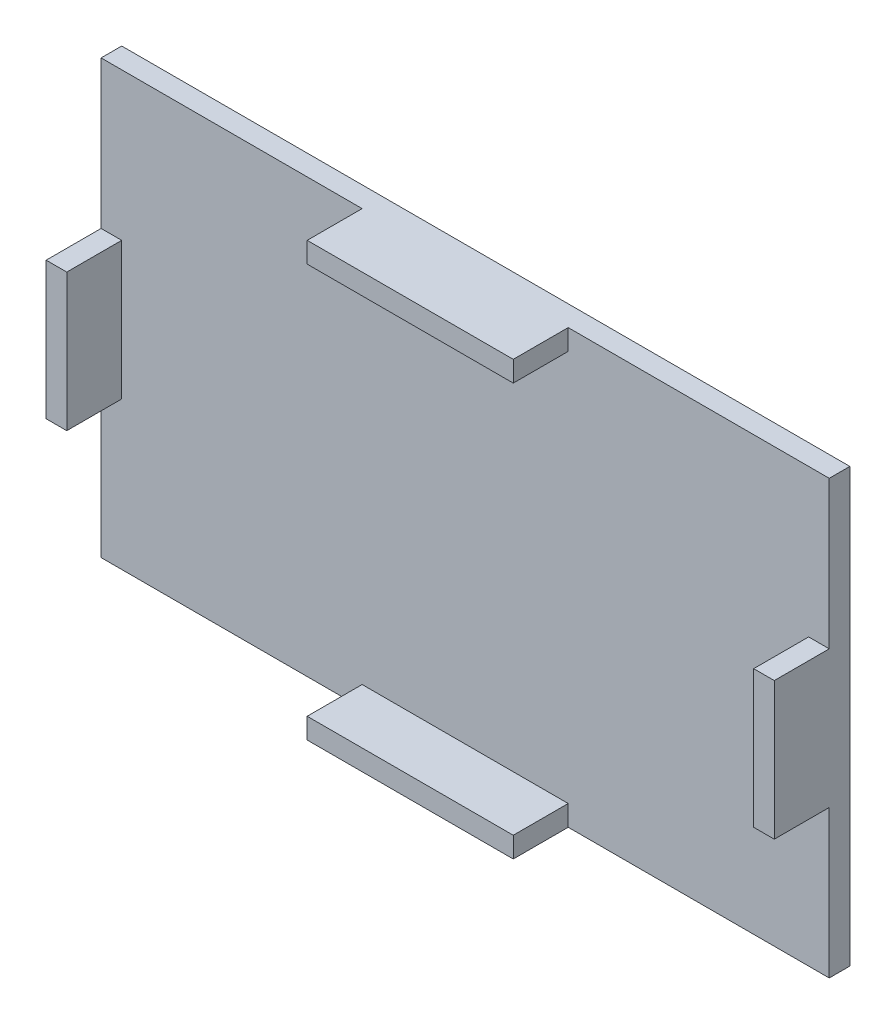
ISO-10303-21;
HEADER;
FILE_DESCRIPTION(('STEP AP214'),'2;1');
FILE_NAME('part.step','',(''),(''),'','','');
FILE_SCHEMA(('AUTOMOTIVE_DESIGN { 1 0 10303 214 1 1 1 1 }'));
ENDSEC;
DATA;
#1=APPLICATION_CONTEXT('core data for automotive mechanical design processes');
#2=APPLICATION_PROTOCOL_DEFINITION('international standard','automotive_design',2000,#1);
#3=PRODUCT_CONTEXT('',#1,'mechanical');
#4=PRODUCT('Part','Part','',(#3));
#5=PRODUCT_RELATED_PRODUCT_CATEGORY('part','',(#4));
#6=PRODUCT_DEFINITION_FORMATION('','',#4);
#7=PRODUCT_DEFINITION_CONTEXT('part definition',#1,'design');
#8=PRODUCT_DEFINITION('design','',#6,#7);
#9=PRODUCT_DEFINITION_SHAPE('','',#8);
#10=(LENGTH_UNIT() NAMED_UNIT(*) SI_UNIT(.MILLI.,.METRE.));
#11=(NAMED_UNIT(*) PLANE_ANGLE_UNIT() SI_UNIT($,.RADIAN.));
#12=(NAMED_UNIT(*) SI_UNIT($,.STERADIAN.) SOLID_ANGLE_UNIT());
#13=UNCERTAINTY_MEASURE_WITH_UNIT(LENGTH_MEASURE(1.E-05),#10,'distance_accuracy_value','');
#14=(GEOMETRIC_REPRESENTATION_CONTEXT(3) GLOBAL_UNCERTAINTY_ASSIGNED_CONTEXT((#13)) GLOBAL_UNIT_ASSIGNED_CONTEXT((#10,
#11,#12)) REPRESENTATION_CONTEXT('',''));
#15=CARTESIAN_POINT('',(0.,0.,0.));
#16=DIRECTION('',(0.,0.,1.));
#17=DIRECTION('',(1.,0.,0.));
#18=AXIS2_PLACEMENT_3D('',#15,#16,#17);
#19=CARTESIAN_POINT('',(0.,0.,1.5));
#20=DIRECTION('',(0.,0.,-1.));
#21=DIRECTION('',(-1.,0.,0.));
#22=AXIS2_PLACEMENT_3D('',#19,#20,#21);
#23=PLANE('',#22);
#24=DIRECTION('',(0.,1.,0.));
#25=VECTOR('',#24,1.);
#26=CARTESIAN_POINT('',(34.,0.,1.5));
#27=LINE('',#26,#25);
#28=CARTESIAN_POINT('',(34.,0.,1.5));
#29=VERTEX_POINT('',#28);
#30=CARTESIAN_POINT('',(34.,1.5,1.5));
#31=VERTEX_POINT('',#30);
#32=EDGE_CURVE('E335',#29,#31,#27,.T.);
#33=ORIENTED_EDGE('',*,*,#32,.F.);
#34=DIRECTION('',(1.,0.,0.));
#35=VECTOR('',#34,1.);
#36=CARTESIAN_POINT('',(53.,0.,1.5));
#37=LINE('',#36,#35);
#38=CARTESIAN_POINT('',(53.,0.,1.5));
#39=VERTEX_POINT('',#38);
#40=EDGE_CURVE('E191',#29,#39,#37,.T.);
#41=ORIENTED_EDGE('',*,*,#40,.T.);
#42=DIRECTION('',(0.,1.,0.));
#43=VECTOR('',#42,1.);
#44=CARTESIAN_POINT('',(53.,31.5,1.5));
#45=LINE('',#44,#43);
#46=CARTESIAN_POINT('',(53.,10.75,1.5));
#47=VERTEX_POINT('',#46);
#48=EDGE_CURVE('E291',#39,#47,#45,.T.);
#49=ORIENTED_EDGE('',*,*,#48,.T.);
#50=DIRECTION('',(1.,0.,0.));
#51=VECTOR('',#50,1.);
#52=CARTESIAN_POINT('',(51.5,10.75,1.5));
#53=LINE('',#52,#51);
#54=CARTESIAN_POINT('',(51.5,10.75,1.5));
#55=VERTEX_POINT('',#54);
#56=EDGE_CURVE('E205',#55,#47,#53,.T.);
#57=ORIENTED_EDGE('',*,*,#56,.F.);
#58=DIRECTION('',(0.,-1.,0.));
#59=VECTOR('',#58,1.);
#60=CARTESIAN_POINT('',(51.5,20.75,1.5));
#61=LINE('',#60,#59);
#62=CARTESIAN_POINT('',(51.5,20.75,1.5));
#63=VERTEX_POINT('',#62);
#64=EDGE_CURVE('E195',#63,#55,#61,.T.);
#65=ORIENTED_EDGE('',*,*,#64,.F.);
#66=DIRECTION('',(-1.,0.,0.));
#67=VECTOR('',#66,1.);
#68=CARTESIAN_POINT('',(53.,20.75,1.5));
#69=LINE('',#68,#67);
#70=CARTESIAN_POINT('',(53.,20.75,1.5));
#71=VERTEX_POINT('',#70);
#72=EDGE_CURVE('E192',#71,#63,#69,.T.);
#73=ORIENTED_EDGE('',*,*,#72,.F.);
#74=CARTESIAN_POINT('',(53.,31.5,1.5));
#75=VERTEX_POINT('',#74);
#76=EDGE_CURVE('E290',#71,#75,#45,.T.);
#77=ORIENTED_EDGE('',*,*,#76,.T.);
#78=DIRECTION('',(-1.,0.,0.));
#79=VECTOR('',#78,1.);
#80=CARTESIAN_POINT('',(0.,31.5,1.5));
#81=LINE('',#80,#79);
#82=CARTESIAN_POINT('',(34.,31.5,1.5));
#83=VERTEX_POINT('',#82);
#84=EDGE_CURVE('E294',#75,#83,#81,.T.);
#85=ORIENTED_EDGE('',*,*,#84,.T.);
#86=DIRECTION('',(0.,1.,0.));
#87=VECTOR('',#86,1.);
#88=CARTESIAN_POINT('',(34.,30.,1.5));
#89=LINE('',#88,#87);
#90=CARTESIAN_POINT('',(34.,30.,1.5));
#91=VERTEX_POINT('',#90);
#92=EDGE_CURVE('E232',#91,#83,#89,.T.);
#93=ORIENTED_EDGE('',*,*,#92,.F.);
#94=DIRECTION('',(1.,0.,0.));
#95=VECTOR('',#94,1.);
#96=CARTESIAN_POINT('',(19.,30.,1.5));
#97=LINE('',#96,#95);
#98=CARTESIAN_POINT('',(19.,30.,1.5));
#99=VERTEX_POINT('',#98);
#100=EDGE_CURVE('E241',#99,#91,#97,.T.);
#101=ORIENTED_EDGE('',*,*,#100,.F.);
#102=DIRECTION('',(0.,-1.,0.));
#103=VECTOR('',#102,1.);
#104=CARTESIAN_POINT('',(19.,31.5,1.5));
#105=LINE('',#104,#103);
#106=CARTESIAN_POINT('',(19.,31.5,1.5));
#107=VERTEX_POINT('',#106);
#108=EDGE_CURVE('E227',#107,#99,#105,.T.);
#109=ORIENTED_EDGE('',*,*,#108,.F.);
#110=CARTESIAN_POINT('',(0.,31.5,1.5));
#111=VERTEX_POINT('',#110);
#112=EDGE_CURVE('E293',#107,#111,#81,.T.);
#113=ORIENTED_EDGE('',*,*,#112,.T.);
#114=DIRECTION('',(0.,-1.,0.));
#115=VECTOR('',#114,1.);
#116=CARTESIAN_POINT('',(0.,0.,1.5));
#117=LINE('',#116,#115);
#118=CARTESIAN_POINT('',(0.,20.75,1.5));
#119=VERTEX_POINT('',#118);
#120=EDGE_CURVE('E297',#111,#119,#117,.T.);
#121=ORIENTED_EDGE('',*,*,#120,.T.);
#122=DIRECTION('',(-1.,0.,0.));
#123=VECTOR('',#122,1.);
#124=CARTESIAN_POINT('',(0.,20.75,1.5));
#125=LINE('',#124,#123);
#126=CARTESIAN_POINT('',(1.5,20.75,1.5));
#127=VERTEX_POINT('',#126);
#128=EDGE_CURVE('E262',#127,#119,#125,.T.);
#129=ORIENTED_EDGE('',*,*,#128,.F.);
#130=DIRECTION('',(0.,1.,0.));
#131=VECTOR('',#130,1.);
#132=CARTESIAN_POINT('',(1.5,20.75,1.5));
#133=LINE('',#132,#131);
#134=CARTESIAN_POINT('',(1.5,10.75,1.5));
#135=VERTEX_POINT('',#134);
#136=EDGE_CURVE('E271',#135,#127,#133,.T.);
#137=ORIENTED_EDGE('',*,*,#136,.F.);
#138=DIRECTION('',(1.,0.,0.));
#139=VECTOR('',#138,1.);
#140=CARTESIAN_POINT('',(1.5,10.75,1.5));
#141=LINE('',#140,#139);
#142=CARTESIAN_POINT('',(0.,10.75,1.5));
#143=VERTEX_POINT('',#142);
#144=EDGE_CURVE('E257',#143,#135,#141,.T.);
#145=ORIENTED_EDGE('',*,*,#144,.F.);
#146=CARTESIAN_POINT('',(0.,0.,1.5));
#147=VERTEX_POINT('',#146);
#148=EDGE_CURVE('E296',#143,#147,#117,.T.);
#149=ORIENTED_EDGE('',*,*,#148,.T.);
#150=CARTESIAN_POINT('',(19.,0.,1.5));
#151=VERTEX_POINT('',#150);
#152=EDGE_CURVE('E288',#147,#151,#37,.T.);
#153=ORIENTED_EDGE('',*,*,#152,.T.);
#154=DIRECTION('',(0.,-1.,0.));
#155=VECTOR('',#154,1.);
#156=CARTESIAN_POINT('',(19.,1.5,1.5));
#157=LINE('',#156,#155);
#158=CARTESIAN_POINT('',(19.,1.5,1.5));
#159=VERTEX_POINT('',#158);
#160=EDGE_CURVE('E53',#159,#151,#157,.T.);
#161=ORIENTED_EDGE('',*,*,#160,.F.);
#162=DIRECTION('',(-1.,0.,0.));
#163=VECTOR('',#162,1.);
#164=CARTESIAN_POINT('',(34.,1.5,1.5));
#165=LINE('',#164,#163);
#166=EDGE_CURVE('E48',#31,#159,#165,.T.);
#167=ORIENTED_EDGE('',*,*,#166,.F.);
#168=EDGE_LOOP('',(#33,#41,#49,#57,#65,#73,#77,#85,#93,#101,#109,#113,#121,#129,#137,#145,#149,
#153,#161,#167));
#169=FACE_BOUND('',#168,.T.);
#170=ADVANCED_FACE('F33',(#169),#23,.F.);
#171=CARTESIAN_POINT('',(53.,0.,1.5));
#172=DIRECTION('',(0.,1.,0.));
#173=DIRECTION('',(-1.,0.,0.));
#174=AXIS2_PLACEMENT_3D('',#171,#172,#173);
#175=PLANE('',#174);
#176=DIRECTION('',(1.,0.,0.));
#177=VECTOR('',#176,1.);
#178=CARTESIAN_POINT('',(53.,0.,0.));
#179=LINE('',#178,#177);
#180=CARTESIAN_POINT('',(0.,0.,0.));
#181=VERTEX_POINT('',#180);
#182=CARTESIAN_POINT('',(53.,0.,0.));
#183=VERTEX_POINT('',#182);
#184=EDGE_CURVE('E287',#181,#183,#179,.T.);
#185=ORIENTED_EDGE('',*,*,#184,.T.);
#186=DIRECTION('',(0.,0.,-1.));
#187=VECTOR('',#186,1.);
#188=CARTESIAN_POINT('',(53.,0.,1.5));
#189=LINE('',#188,#187);
#190=EDGE_CURVE('E11',#39,#183,#189,.T.);
#191=ORIENTED_EDGE('',*,*,#190,.F.);
#192=ORIENTED_EDGE('',*,*,#40,.F.);
#193=DIRECTION('',(0.,0.,-1.));
#194=VECTOR('',#193,1.);
#195=CARTESIAN_POINT('',(34.,0.,5.5));
#196=LINE('',#195,#194);
#197=CARTESIAN_POINT('',(34.,0.,5.5));
#198=VERTEX_POINT('',#197);
#199=EDGE_CURVE('E173',#198,#29,#196,.T.);
#200=ORIENTED_EDGE('',*,*,#199,.F.);
#201=DIRECTION('',(1.,0.,0.));
#202=VECTOR('',#201,1.);
#203=CARTESIAN_POINT('',(19.,0.,5.5));
#204=LINE('',#203,#202);
#205=CARTESIAN_POINT('',(19.,0.,5.5));
#206=VERTEX_POINT('',#205);
#207=EDGE_CURVE('E179',#206,#198,#204,.T.);
#208=ORIENTED_EDGE('',*,*,#207,.F.);
#209=DIRECTION('',(0.,0.,-1.));
#210=VECTOR('',#209,1.);
#211=CARTESIAN_POINT('',(19.,0.,5.5));
#212=LINE('',#211,#210);
#213=EDGE_CURVE('E329',#206,#151,#212,.T.);
#214=ORIENTED_EDGE('',*,*,#213,.T.);
#215=ORIENTED_EDGE('',*,*,#152,.F.);
#216=DIRECTION('',(0.,0.,-1.));
#217=VECTOR('',#216,1.);
#218=CARTESIAN_POINT('',(0.,0.,1.5));
#219=LINE('',#218,#217);
#220=EDGE_CURVE('E299',#147,#181,#219,.T.);
#221=ORIENTED_EDGE('',*,*,#220,.T.);
#222=EDGE_LOOP('',(#185,#191,#192,#200,#208,#214,#215,#221));
#223=FACE_BOUND('',#222,.T.);
#224=ADVANCED_FACE('F35',(#223),#175,.F.);
#225=CARTESIAN_POINT('',(53.,31.5,1.5));
#226=DIRECTION('',(-1.,0.,0.));
#227=DIRECTION('',(0.,-1.,0.));
#228=AXIS2_PLACEMENT_3D('',#225,#226,#227);
#229=PLANE('',#228);
#230=DIRECTION('',(0.,1.,0.));
#231=VECTOR('',#230,1.);
#232=CARTESIAN_POINT('',(53.,31.5,0.));
#233=LINE('',#232,#231);
#234=CARTESIAN_POINT('',(53.,31.5,0.));
#235=VERTEX_POINT('',#234);
#236=EDGE_CURVE('E301',#183,#235,#233,.T.);
#237=ORIENTED_EDGE('',*,*,#236,.T.);
#238=DIRECTION('',(0.,0.,-1.));
#239=VECTOR('',#238,1.);
#240=CARTESIAN_POINT('',(53.,31.5,1.5));
#241=LINE('',#240,#239);
#242=EDGE_CURVE('E41',#75,#235,#241,.T.);
#243=ORIENTED_EDGE('',*,*,#242,.F.);
#244=ORIENTED_EDGE('',*,*,#76,.F.);
#245=DIRECTION('',(0.,0.,-1.));
#246=VECTOR('',#245,1.);
#247=CARTESIAN_POINT('',(53.,20.75,5.5));
#248=LINE('',#247,#246);
#249=CARTESIAN_POINT('',(53.,20.75,5.5));
#250=VERTEX_POINT('',#249);
#251=EDGE_CURVE('E224',#250,#71,#248,.T.);
#252=ORIENTED_EDGE('',*,*,#251,.F.);
#253=DIRECTION('',(0.,1.,0.));
#254=VECTOR('',#253,1.);
#255=CARTESIAN_POINT('',(53.,20.75,5.5));
#256=LINE('',#255,#254);
#257=CARTESIAN_POINT('',(53.,10.75,5.5));
#258=VERTEX_POINT('',#257);
#259=EDGE_CURVE('E201',#258,#250,#256,.T.);
#260=ORIENTED_EDGE('',*,*,#259,.F.);
#261=DIRECTION('',(0.,0.,-1.));
#262=VECTOR('',#261,1.);
#263=CARTESIAN_POINT('',(53.,10.75,5.5));
#264=LINE('',#263,#262);
#265=EDGE_CURVE('E210',#258,#47,#264,.T.);
#266=ORIENTED_EDGE('',*,*,#265,.T.);
#267=ORIENTED_EDGE('',*,*,#48,.F.);
#268=ORIENTED_EDGE('',*,*,#190,.T.);
#269=EDGE_LOOP('',(#237,#243,#244,#252,#260,#266,#267,#268));
#270=FACE_BOUND('',#269,.T.);
#271=ADVANCED_FACE('F357',(#270),#229,.F.);
#272=CARTESIAN_POINT('',(0.,31.5,1.5));
#273=DIRECTION('',(0.,-1.,0.));
#274=DIRECTION('',(0.,0.,-1.));
#275=AXIS2_PLACEMENT_3D('',#272,#273,#274);
#276=PLANE('',#275);
#277=DIRECTION('',(-1.,0.,0.));
#278=VECTOR('',#277,1.);
#279=CARTESIAN_POINT('',(0.,31.5,0.));
#280=LINE('',#279,#278);
#281=CARTESIAN_POINT('',(0.,31.5,0.));
#282=VERTEX_POINT('',#281);
#283=EDGE_CURVE('E303',#235,#282,#280,.T.);
#284=ORIENTED_EDGE('',*,*,#283,.T.);
#285=DIRECTION('',(0.,0.,-1.));
#286=VECTOR('',#285,1.);
#287=CARTESIAN_POINT('',(0.,31.5,1.5));
#288=LINE('',#287,#286);
#289=EDGE_CURVE('E309',#111,#282,#288,.T.);
#290=ORIENTED_EDGE('',*,*,#289,.F.);
#291=ORIENTED_EDGE('',*,*,#112,.F.);
#292=DIRECTION('',(0.,0.,-1.));
#293=VECTOR('',#292,1.);
#294=CARTESIAN_POINT('',(19.,31.5,5.5));
#295=LINE('',#294,#293);
#296=CARTESIAN_POINT('',(19.,31.5,5.5));
#297=VERTEX_POINT('',#296);
#298=EDGE_CURVE('E254',#297,#107,#295,.T.);
#299=ORIENTED_EDGE('',*,*,#298,.F.);
#300=DIRECTION('',(-1.,0.,0.));
#301=VECTOR('',#300,1.);
#302=CARTESIAN_POINT('',(34.,31.5,5.5));
#303=LINE('',#302,#301);
#304=CARTESIAN_POINT('',(34.,31.5,5.5));
#305=VERTEX_POINT('',#304);
#306=EDGE_CURVE('E228',#305,#297,#303,.T.);
#307=ORIENTED_EDGE('',*,*,#306,.F.);
#308=DIRECTION('',(0.,0.,-1.));
#309=VECTOR('',#308,1.);
#310=CARTESIAN_POINT('',(34.,31.5,5.5));
#311=LINE('',#310,#309);
#312=EDGE_CURVE('E238',#305,#83,#311,.T.);
#313=ORIENTED_EDGE('',*,*,#312,.T.);
#314=ORIENTED_EDGE('',*,*,#84,.F.);
#315=ORIENTED_EDGE('',*,*,#242,.T.);
#316=EDGE_LOOP('',(#284,#290,#291,#299,#307,#313,#314,#315));
#317=FACE_BOUND('',#316,.T.);
#318=ADVANCED_FACE('F316',(#317),#276,.F.);
#319=CARTESIAN_POINT('',(0.,0.,1.5));
#320=DIRECTION('',(1.,0.,0.));
#321=DIRECTION('',(0.,0.,-1.));
#322=AXIS2_PLACEMENT_3D('',#319,#320,#321);
#323=PLANE('',#322);
#324=DIRECTION('',(0.,-1.,0.));
#325=VECTOR('',#324,1.);
#326=CARTESIAN_POINT('',(0.,0.,0.));
#327=LINE('',#326,#325);
#328=EDGE_CURVE('E305',#282,#181,#327,.T.);
#329=ORIENTED_EDGE('',*,*,#328,.T.);
#330=ORIENTED_EDGE('',*,*,#220,.F.);
#331=ORIENTED_EDGE('',*,*,#148,.F.);
#332=DIRECTION('',(0.,0.,-1.));
#333=VECTOR('',#332,1.);
#334=CARTESIAN_POINT('',(0.,10.75,5.5));
#335=LINE('',#334,#333);
#336=CARTESIAN_POINT('',(0.,10.75,5.5));
#337=VERTEX_POINT('',#336);
#338=EDGE_CURVE('E284',#337,#143,#335,.T.);
#339=ORIENTED_EDGE('',*,*,#338,.F.);
#340=DIRECTION('',(0.,-1.,0.));
#341=VECTOR('',#340,1.);
#342=CARTESIAN_POINT('',(0.,10.75,5.5));
#343=LINE('',#342,#341);
#344=CARTESIAN_POINT('',(0.,20.75,5.5));
#345=VERTEX_POINT('',#344);
#346=EDGE_CURVE('E258',#345,#337,#343,.T.);
#347=ORIENTED_EDGE('',*,*,#346,.F.);
#348=DIRECTION('',(0.,0.,-1.));
#349=VECTOR('',#348,1.);
#350=CARTESIAN_POINT('',(0.,20.75,5.5));
#351=LINE('',#350,#349);
#352=EDGE_CURVE('E268',#345,#119,#351,.T.);
#353=ORIENTED_EDGE('',*,*,#352,.T.);
#354=ORIENTED_EDGE('',*,*,#120,.F.);
#355=ORIENTED_EDGE('',*,*,#289,.T.);
#356=EDGE_LOOP('',(#329,#330,#331,#339,#347,#353,#354,#355));
#357=FACE_BOUND('',#356,.T.);
#358=ADVANCED_FACE('F325',(#357),#323,.F.);
#359=CARTESIAN_POINT('',(0.,0.,0.));
#360=DIRECTION('',(0.,0.,-1.));
#361=DIRECTION('',(-1.,0.,0.));
#362=AXIS2_PLACEMENT_3D('',#359,#360,#361);
#363=PLANE('',#362);
#364=ORIENTED_EDGE('',*,*,#184,.F.);
#365=ORIENTED_EDGE('',*,*,#328,.F.);
#366=ORIENTED_EDGE('',*,*,#283,.F.);
#367=ORIENTED_EDGE('',*,*,#236,.F.);
#368=EDGE_LOOP('',(#364,#365,#366,#367));
#369=FACE_BOUND('',#368,.T.);
#370=ADVANCED_FACE('F322',(#369),#363,.T.);
#371=CARTESIAN_POINT('',(1.5,10.75,5.5));
#372=DIRECTION('',(0.,1.,0.));
#373=DIRECTION('',(0.,0.,1.));
#374=AXIS2_PLACEMENT_3D('',#371,#372,#373);
#375=PLANE('',#374);
#376=ORIENTED_EDGE('',*,*,#144,.T.);
#377=DIRECTION('',(0.,0.,-1.));
#378=VECTOR('',#377,1.);
#379=CARTESIAN_POINT('',(1.5,10.75,5.5));
#380=LINE('',#379,#378);
#381=CARTESIAN_POINT('',(1.5,10.75,5.5));
#382=VERTEX_POINT('',#381);
#383=EDGE_CURVE('E281',#382,#135,#380,.T.);
#384=ORIENTED_EDGE('',*,*,#383,.F.);
#385=DIRECTION('',(1.,0.,0.));
#386=VECTOR('',#385,1.);
#387=CARTESIAN_POINT('',(1.5,10.75,5.5));
#388=LINE('',#387,#386);
#389=EDGE_CURVE('E261',#337,#382,#388,.T.);
#390=ORIENTED_EDGE('',*,*,#389,.F.);
#391=ORIENTED_EDGE('',*,*,#338,.T.);
#392=EDGE_LOOP('',(#376,#384,#390,#391));
#393=FACE_BOUND('',#392,.T.);
#394=ADVANCED_FACE('F360',(#393),#375,.F.);
#395=CARTESIAN_POINT('',(1.5,20.75,5.5));
#396=DIRECTION('',(-1.,0.,0.));
#397=DIRECTION('',(0.,-1.,0.));
#398=AXIS2_PLACEMENT_3D('',#395,#396,#397);
#399=PLANE('',#398);
#400=ORIENTED_EDGE('',*,*,#136,.T.);
#401=DIRECTION('',(0.,0.,-1.));
#402=VECTOR('',#401,1.);
#403=CARTESIAN_POINT('',(1.5,20.75,5.5));
#404=LINE('',#403,#402);
#405=CARTESIAN_POINT('',(1.5,20.75,5.5));
#406=VERTEX_POINT('',#405);
#407=EDGE_CURVE('E278',#406,#127,#404,.T.);
#408=ORIENTED_EDGE('',*,*,#407,.F.);
#409=DIRECTION('',(0.,1.,0.));
#410=VECTOR('',#409,1.);
#411=CARTESIAN_POINT('',(1.5,20.75,5.5));
#412=LINE('',#411,#410);
#413=EDGE_CURVE('E264',#382,#406,#412,.T.);
#414=ORIENTED_EDGE('',*,*,#413,.F.);
#415=ORIENTED_EDGE('',*,*,#383,.T.);
#416=EDGE_LOOP('',(#400,#408,#414,#415));
#417=FACE_BOUND('',#416,.T.);
#418=ADVANCED_FACE('F415',(#417),#399,.F.);
#419=CARTESIAN_POINT('',(0.,20.75,5.5));
#420=DIRECTION('',(0.,-1.,0.));
#421=DIRECTION('',(1.,0.,0.));
#422=AXIS2_PLACEMENT_3D('',#419,#420,#421);
#423=PLANE('',#422);
#424=ORIENTED_EDGE('',*,*,#128,.T.);
#425=ORIENTED_EDGE('',*,*,#352,.F.);
#426=DIRECTION('',(-1.,0.,0.));
#427=VECTOR('',#426,1.);
#428=CARTESIAN_POINT('',(0.,20.75,5.5));
#429=LINE('',#428,#427);
#430=EDGE_CURVE('E266',#406,#345,#429,.T.);
#431=ORIENTED_EDGE('',*,*,#430,.F.);
#432=ORIENTED_EDGE('',*,*,#407,.T.);
#433=EDGE_LOOP('',(#424,#425,#431,#432));
#434=FACE_BOUND('',#433,.T.);
#435=ADVANCED_FACE('F409',(#434),#423,.F.);
#436=CARTESIAN_POINT('',(0.,0.,5.5));
#437=DIRECTION('',(0.,0.,-1.));
#438=DIRECTION('',(-1.,0.,0.));
#439=AXIS2_PLACEMENT_3D('',#436,#437,#438);
#440=PLANE('',#439);
#441=ORIENTED_EDGE('',*,*,#346,.T.);
#442=ORIENTED_EDGE('',*,*,#389,.T.);
#443=ORIENTED_EDGE('',*,*,#413,.T.);
#444=ORIENTED_EDGE('',*,*,#430,.T.);
#445=EDGE_LOOP('',(#441,#442,#443,#444));
#446=FACE_BOUND('',#445,.T.);
#447=ADVANCED_FACE('F402',(#446),#440,.F.);
#448=CARTESIAN_POINT('',(19.,31.5,5.5));
#449=DIRECTION('',(1.,0.,0.));
#450=DIRECTION('',(0.,1.,0.));
#451=AXIS2_PLACEMENT_3D('',#448,#449,#450);
#452=PLANE('',#451);
#453=ORIENTED_EDGE('',*,*,#108,.T.);
#454=DIRECTION('',(0.,0.,-1.));
#455=VECTOR('',#454,1.);
#456=CARTESIAN_POINT('',(19.,30.,5.5));
#457=LINE('',#456,#455);
#458=CARTESIAN_POINT('',(19.,30.,5.5));
#459=VERTEX_POINT('',#458);
#460=EDGE_CURVE('E251',#459,#99,#457,.T.);
#461=ORIENTED_EDGE('',*,*,#460,.F.);
#462=DIRECTION('',(0.,-1.,0.));
#463=VECTOR('',#462,1.);
#464=CARTESIAN_POINT('',(19.,31.5,5.5));
#465=LINE('',#464,#463);
#466=EDGE_CURVE('E231',#297,#459,#465,.T.);
#467=ORIENTED_EDGE('',*,*,#466,.F.);
#468=ORIENTED_EDGE('',*,*,#298,.T.);
#469=EDGE_LOOP('',(#453,#461,#467,#468));
#470=FACE_BOUND('',#469,.T.);
#471=ADVANCED_FACE('F400',(#470),#452,.F.);
#472=CARTESIAN_POINT('',(19.,30.,5.5));
#473=DIRECTION('',(0.,1.,0.));
#474=DIRECTION('',(0.,0.,1.));
#475=AXIS2_PLACEMENT_3D('',#472,#473,#474);
#476=PLANE('',#475);
#477=ORIENTED_EDGE('',*,*,#100,.T.);
#478=DIRECTION('',(0.,0.,-1.));
#479=VECTOR('',#478,1.);
#480=CARTESIAN_POINT('',(34.,30.,5.5));
#481=LINE('',#480,#479);
#482=CARTESIAN_POINT('',(34.,30.,5.5));
#483=VERTEX_POINT('',#482);
#484=EDGE_CURVE('E248',#483,#91,#481,.T.);
#485=ORIENTED_EDGE('',*,*,#484,.F.);
#486=DIRECTION('',(1.,0.,0.));
#487=VECTOR('',#486,1.);
#488=CARTESIAN_POINT('',(19.,30.,5.5));
#489=LINE('',#488,#487);
#490=EDGE_CURVE('E234',#459,#483,#489,.T.);
#491=ORIENTED_EDGE('',*,*,#490,.F.);
#492=ORIENTED_EDGE('',*,*,#460,.T.);
#493=EDGE_LOOP('',(#477,#485,#491,#492));
#494=FACE_BOUND('',#493,.T.);
#495=ADVANCED_FACE('F397',(#494),#476,.F.);
#496=CARTESIAN_POINT('',(34.,30.,5.5));
#497=DIRECTION('',(-1.,0.,0.));
#498=DIRECTION('',(0.,0.,1.));
#499=AXIS2_PLACEMENT_3D('',#496,#497,#498);
#500=PLANE('',#499);
#501=ORIENTED_EDGE('',*,*,#92,.T.);
#502=ORIENTED_EDGE('',*,*,#312,.F.);
#503=DIRECTION('',(0.,1.,0.));
#504=VECTOR('',#503,1.);
#505=CARTESIAN_POINT('',(34.,30.,5.5));
#506=LINE('',#505,#504);
#507=EDGE_CURVE('E236',#483,#305,#506,.T.);
#508=ORIENTED_EDGE('',*,*,#507,.F.);
#509=ORIENTED_EDGE('',*,*,#484,.T.);
#510=EDGE_LOOP('',(#501,#502,#508,#509));
#511=FACE_BOUND('',#510,.T.);
#512=ADVANCED_FACE('F387',(#511),#500,.F.);
#513=CARTESIAN_POINT('',(0.,0.,5.5));
#514=DIRECTION('',(0.,0.,1.));
#515=DIRECTION('',(1.,0.,0.));
#516=AXIS2_PLACEMENT_3D('',#513,#514,#515);
#517=PLANE('',#516);
#518=ORIENTED_EDGE('',*,*,#306,.T.);
#519=ORIENTED_EDGE('',*,*,#466,.T.);
#520=ORIENTED_EDGE('',*,*,#490,.T.);
#521=ORIENTED_EDGE('',*,*,#507,.T.);
#522=EDGE_LOOP('',(#518,#519,#520,#521));
#523=FACE_BOUND('',#522,.T.);
#524=ADVANCED_FACE('F393',(#523),#517,.T.);
#525=CARTESIAN_POINT('',(53.,20.75,5.5));
#526=DIRECTION('',(0.,-1.,0.));
#527=DIRECTION('',(0.,0.,-1.));
#528=AXIS2_PLACEMENT_3D('',#525,#526,#527);
#529=PLANE('',#528);
#530=ORIENTED_EDGE('',*,*,#72,.T.);
#531=DIRECTION('',(0.,0.,-1.));
#532=VECTOR('',#531,1.);
#533=CARTESIAN_POINT('',(51.5,20.75,5.5));
#534=LINE('',#533,#532);
#535=CARTESIAN_POINT('',(51.5,20.75,5.5));
#536=VERTEX_POINT('',#535);
#537=EDGE_CURVE('E221',#536,#63,#534,.T.);
#538=ORIENTED_EDGE('',*,*,#537,.F.);
#539=DIRECTION('',(-1.,0.,0.));
#540=VECTOR('',#539,1.);
#541=CARTESIAN_POINT('',(53.,20.75,5.5));
#542=LINE('',#541,#540);
#543=EDGE_CURVE('E204',#250,#536,#542,.T.);
#544=ORIENTED_EDGE('',*,*,#543,.F.);
#545=ORIENTED_EDGE('',*,*,#251,.T.);
#546=EDGE_LOOP('',(#530,#538,#544,#545));
#547=FACE_BOUND('',#546,.T.);
#548=ADVANCED_FACE('F383',(#547),#529,.F.);
#549=CARTESIAN_POINT('',(51.5,20.75,5.5));
#550=DIRECTION('',(1.,0.,0.));
#551=DIRECTION('',(0.,1.,0.));
#552=AXIS2_PLACEMENT_3D('',#549,#550,#551);
#553=PLANE('',#552);
#554=ORIENTED_EDGE('',*,*,#64,.T.);
#555=DIRECTION('',(0.,0.,-1.));
#556=VECTOR('',#555,1.);
#557=CARTESIAN_POINT('',(51.5,10.75,5.5));
#558=LINE('',#557,#556);
#559=CARTESIAN_POINT('',(51.5,10.75,5.5));
#560=VERTEX_POINT('',#559);
#561=EDGE_CURVE('E218',#560,#55,#558,.T.);
#562=ORIENTED_EDGE('',*,*,#561,.F.);
#563=DIRECTION('',(0.,-1.,0.));
#564=VECTOR('',#563,1.);
#565=CARTESIAN_POINT('',(51.5,20.75,5.5));
#566=LINE('',#565,#564);
#567=EDGE_CURVE('E207',#536,#560,#566,.T.);
#568=ORIENTED_EDGE('',*,*,#567,.F.);
#569=ORIENTED_EDGE('',*,*,#537,.T.);
#570=EDGE_LOOP('',(#554,#562,#568,#569));
#571=FACE_BOUND('',#570,.T.);
#572=ADVANCED_FACE('F379',(#571),#553,.F.);
#573=CARTESIAN_POINT('',(51.5,10.75,5.5));
#574=DIRECTION('',(0.,1.,0.));
#575=DIRECTION('',(0.,0.,1.));
#576=AXIS2_PLACEMENT_3D('',#573,#574,#575);
#577=PLANE('',#576);
#578=ORIENTED_EDGE('',*,*,#56,.T.);
#579=ORIENTED_EDGE('',*,*,#265,.F.);
#580=DIRECTION('',(1.,0.,0.));
#581=VECTOR('',#580,1.);
#582=CARTESIAN_POINT('',(51.5,10.75,5.5));
#583=LINE('',#582,#581);
#584=EDGE_CURVE('E209',#560,#258,#583,.T.);
#585=ORIENTED_EDGE('',*,*,#584,.F.);
#586=ORIENTED_EDGE('',*,*,#561,.T.);
#587=EDGE_LOOP('',(#578,#579,#585,#586));
#588=FACE_BOUND('',#587,.T.);
#589=ADVANCED_FACE('F374',(#588),#577,.F.);
#590=CARTESIAN_POINT('',(0.,0.,5.5));
#591=DIRECTION('',(0.,0.,1.));
#592=DIRECTION('',(1.,0.,0.));
#593=AXIS2_PLACEMENT_3D('',#590,#591,#592);
#594=PLANE('',#593);
#595=ORIENTED_EDGE('',*,*,#259,.T.);
#596=ORIENTED_EDGE('',*,*,#543,.T.);
#597=ORIENTED_EDGE('',*,*,#567,.T.);
#598=ORIENTED_EDGE('',*,*,#584,.T.);
#599=EDGE_LOOP('',(#595,#596,#597,#598));
#600=FACE_BOUND('',#599,.T.);
#601=ADVANCED_FACE('F350',(#600),#594,.T.);
#602=CARTESIAN_POINT('',(34.,0.,5.5));
#603=DIRECTION('',(-1.,0.,0.));
#604=DIRECTION('',(0.,0.,1.));
#605=AXIS2_PLACEMENT_3D('',#602,#603,#604);
#606=PLANE('',#605);
#607=ORIENTED_EDGE('',*,*,#32,.T.);
#608=DIRECTION('',(0.,0.,-1.));
#609=VECTOR('',#608,1.);
#610=CARTESIAN_POINT('',(34.,1.5,5.5));
#611=LINE('',#610,#609);
#612=CARTESIAN_POINT('',(34.,1.5,5.5));
#613=VERTEX_POINT('',#612);
#614=EDGE_CURVE('E175',#613,#31,#611,.T.);
#615=ORIENTED_EDGE('',*,*,#614,.F.);
#616=DIRECTION('',(0.,1.,0.));
#617=VECTOR('',#616,1.);
#618=CARTESIAN_POINT('',(34.,0.,5.5));
#619=LINE('',#618,#617);
#620=EDGE_CURVE('E169',#198,#613,#619,.T.);
#621=ORIENTED_EDGE('',*,*,#620,.F.);
#622=ORIENTED_EDGE('',*,*,#199,.T.);
#623=EDGE_LOOP('',(#607,#615,#621,#622));
#624=FACE_BOUND('',#623,.T.);
#625=ADVANCED_FACE('F171',(#624),#606,.F.);
#626=CARTESIAN_POINT('',(34.,1.5,5.5));
#627=DIRECTION('',(0.,-1.,0.));
#628=DIRECTION('',(1.,0.,0.));
#629=AXIS2_PLACEMENT_3D('',#626,#627,#628);
#630=PLANE('',#629);
#631=ORIENTED_EDGE('',*,*,#166,.T.);
#632=DIRECTION('',(0.,0.,-1.));
#633=VECTOR('',#632,1.);
#634=CARTESIAN_POINT('',(19.,1.5,5.5));
#635=LINE('',#634,#633);
#636=CARTESIAN_POINT('',(19.,1.5,5.5));
#637=VERTEX_POINT('',#636);
#638=EDGE_CURVE('E197',#637,#159,#635,.T.);
#639=ORIENTED_EDGE('',*,*,#638,.F.);
#640=DIRECTION('',(-1.,0.,0.));
#641=VECTOR('',#640,1.);
#642=CARTESIAN_POINT('',(34.,1.5,5.5));
#643=LINE('',#642,#641);
#644=EDGE_CURVE('E178',#613,#637,#643,.T.);
#645=ORIENTED_EDGE('',*,*,#644,.F.);
#646=ORIENTED_EDGE('',*,*,#614,.T.);
#647=EDGE_LOOP('',(#631,#639,#645,#646));
#648=FACE_BOUND('',#647,.T.);
#649=ADVANCED_FACE('F342',(#648),#630,.F.);
#650=CARTESIAN_POINT('',(19.,1.5,5.5));
#651=DIRECTION('',(1.,0.,0.));
#652=DIRECTION('',(0.,0.,-1.));
#653=AXIS2_PLACEMENT_3D('',#650,#651,#652);
#654=PLANE('',#653);
#655=ORIENTED_EDGE('',*,*,#160,.T.);
#656=ORIENTED_EDGE('',*,*,#213,.F.);
#657=DIRECTION('',(0.,-1.,0.));
#658=VECTOR('',#657,1.);
#659=CARTESIAN_POINT('',(19.,1.5,5.5));
#660=LINE('',#659,#658);
#661=EDGE_CURVE('E184',#637,#206,#660,.T.);
#662=ORIENTED_EDGE('',*,*,#661,.F.);
#663=ORIENTED_EDGE('',*,*,#638,.T.);
#664=EDGE_LOOP('',(#655,#656,#662,#663));
#665=FACE_BOUND('',#664,.T.);
#666=ADVANCED_FACE('F332',(#665),#654,.F.);
#667=CARTESIAN_POINT('',(0.,0.,5.5));
#668=DIRECTION('',(0.,0.,1.));
#669=DIRECTION('',(1.,0.,0.));
#670=AXIS2_PLACEMENT_3D('',#667,#668,#669);
#671=PLANE('',#670);
#672=ORIENTED_EDGE('',*,*,#207,.T.);
#673=ORIENTED_EDGE('',*,*,#620,.T.);
#674=ORIENTED_EDGE('',*,*,#644,.T.);
#675=ORIENTED_EDGE('',*,*,#661,.T.);
#676=EDGE_LOOP('',(#672,#673,#674,#675));
#677=FACE_BOUND('',#676,.T.);
#678=ADVANCED_FACE('F182',(#677),#671,.T.);
#679=CLOSED_SHELL('',(#170,#224,#271,#318,#358,#370,#394,#418,#435,#447,#471,#495,#512,#524,
#548,#572,#589,#601,#625,#649,#666,#678));
#680=MANIFOLD_SOLID_BREP('B2',#679);
#681=ADVANCED_BREP_SHAPE_REPRESENTATION('',(#18,#680),#14);
#682=SHAPE_DEFINITION_REPRESENTATION(#9,#681);
ENDSEC;
END-ISO-10303-21;
